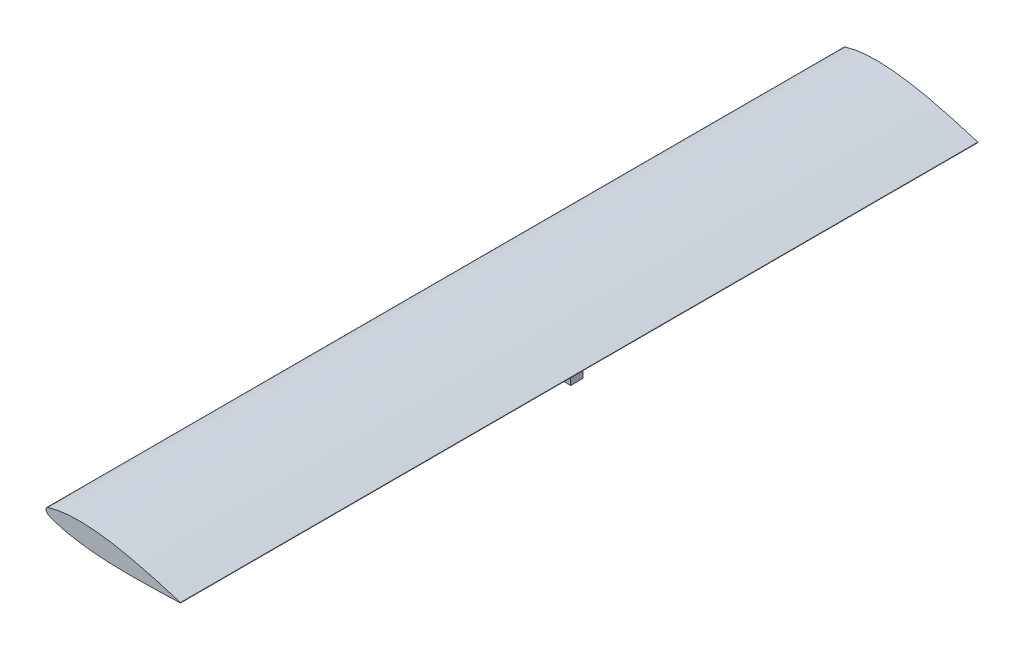
ISO-10303-21;
HEADER;
FILE_DESCRIPTION(('STEP AP214'),'2;1');
FILE_NAME('part.step','',(''),(''),'','','');
FILE_SCHEMA(('AUTOMOTIVE_DESIGN { 1 0 10303 214 1 1 1 1 }'));
ENDSEC;
DATA;
#1=APPLICATION_CONTEXT('core data for automotive mechanical design processes');
#2=APPLICATION_PROTOCOL_DEFINITION('international standard','automotive_design',2000,#1);
#3=PRODUCT_CONTEXT('',#1,'mechanical');
#4=PRODUCT('Part','Part','',(#3));
#5=PRODUCT_RELATED_PRODUCT_CATEGORY('part','',(#4));
#6=PRODUCT_DEFINITION_FORMATION('','',#4);
#7=PRODUCT_DEFINITION_CONTEXT('part definition',#1,'design');
#8=PRODUCT_DEFINITION('design','',#6,#7);
#9=PRODUCT_DEFINITION_SHAPE('','',#8);
#10=(LENGTH_UNIT() NAMED_UNIT(*) SI_UNIT(.MILLI.,.METRE.));
#11=(NAMED_UNIT(*) PLANE_ANGLE_UNIT() SI_UNIT($,.RADIAN.));
#12=(NAMED_UNIT(*) SI_UNIT($,.STERADIAN.) SOLID_ANGLE_UNIT());
#13=UNCERTAINTY_MEASURE_WITH_UNIT(LENGTH_MEASURE(1.E-05),#10,'distance_accuracy_value','');
#14=(GEOMETRIC_REPRESENTATION_CONTEXT(3) GLOBAL_UNCERTAINTY_ASSIGNED_CONTEXT((#13)) GLOBAL_UNIT_ASSIGNED_CONTEXT((#10,
#11,#12)) REPRESENTATION_CONTEXT('',''));
#15=CARTESIAN_POINT('',(0.,0.,0.));
#16=DIRECTION('',(0.,0.,1.));
#17=DIRECTION('',(1.,0.,0.));
#18=AXIS2_PLACEMENT_3D('',#15,#16,#17);
#19=CARTESIAN_POINT('',(9.29048460918074,-9.08103926298808,1590.));
#20=CARTESIAN_POINT('',(82.8889232202925,-36.554453488998,1590.));
#21=CARTESIAN_POINT('',(198.099785007976,-28.7820789022848,1590.));
#22=CARTESIAN_POINT('',(270.840654692993,-27.1694638421733,1590.));
#23=B_SPLINE_CURVE_WITH_KNOTS('',3,(#19,#20,#21,#22),.UNSPECIFIED.,.F.,.F.,(4,4),(0.,1.),.UNSPECIFIED.);
#24=DIRECTION('',(0.,0.,-1.));
#25=VECTOR('',#24,1.);
#26=SURFACE_OF_LINEAR_EXTRUSION('',#23,#25);
#27=CARTESIAN_POINT('',(9.29048460918074,-9.08103926298808,0.));
#28=CARTESIAN_POINT('',(82.8889232202925,-36.554453488998,0.));
#29=CARTESIAN_POINT('',(198.099785007976,-28.7820789022848,0.));
#30=CARTESIAN_POINT('',(270.840654692993,-27.1694638421733,0.));
#31=B_SPLINE_CURVE_WITH_KNOTS('',3,(#27,#28,#29,#30),.UNSPECIFIED.,.F.,.F.,(4,4),(0.,1.),.UNSPECIFIED.);
#32=CARTESIAN_POINT('',(9.29048460918074,-9.08103926298808,0.));
#33=VERTEX_POINT('',#32);
#34=CARTESIAN_POINT('',(267.776708097799,-27.2403195337262,0.));
#35=VERTEX_POINT('',#34);
#36=EDGE_CURVE('E166',#33,#35,#31,.T.);
#37=ORIENTED_EDGE('',*,*,#36,.T.);
#38=DIRECTION('',(0.,0.,-1.));
#39=VECTOR('',#38,1.);
#40=CARTESIAN_POINT('',(267.776708097814,-27.2403195337258,0.));
#41=LINE('',#40,#39);
#42=CARTESIAN_POINT('',(267.776708097799,-27.2403195337262,1590.));
#43=VERTEX_POINT('',#42);
#44=EDGE_CURVE('E41',#35,#43,#41,.F.);
#45=ORIENTED_EDGE('',*,*,#44,.T.);
#46=CARTESIAN_POINT('',(9.29048460918074,-9.08103926298808,1590.));
#47=VERTEX_POINT('',#46);
#48=EDGE_CURVE('E128',#47,#43,#23,.T.);
#49=ORIENTED_EDGE('',*,*,#48,.F.);
#50=DIRECTION('',(0.,0.,-1.));
#51=VECTOR('',#50,1.);
#52=CARTESIAN_POINT('',(9.29048460918074,-9.08103926298808,1590.));
#53=LINE('',#52,#51);
#54=EDGE_CURVE('E165',#47,#33,#53,.T.);
#55=ORIENTED_EDGE('',*,*,#54,.T.);
#56=EDGE_LOOP('',(#37,#45,#49,#55));
#57=FACE_BOUND('',#56,.T.);
#58=DIRECTION('',(0.,0.,-1.));
#59=VECTOR('',#58,1.);
#60=CARTESIAN_POINT('',(263.53359635349,-27.3469635738188,1590.));
#61=LINE('',#60,#59);
#62=CARTESIAN_POINT('',(263.533596353484,-27.346963573819,807.5));
#63=VERTEX_POINT('',#62);
#64=CARTESIAN_POINT('',(263.533596353484,-27.346963573819,782.5));
#65=VERTEX_POINT('',#64);
#66=EDGE_CURVE('E48',#63,#65,#61,.T.);
#67=ORIENTED_EDGE('',*,*,#66,.T.);
#68=CARTESIAN_POINT('',(9.29048460918074,-9.08103926298808,782.5));
#69=CARTESIAN_POINT('',(82.8889232202925,-36.554453488998,782.5));
#70=CARTESIAN_POINT('',(198.099785007976,-28.7820789022848,782.5));
#71=CARTESIAN_POINT('',(270.840654692993,-27.1694638421733,782.5));
#72=B_SPLINE_CURVE_WITH_KNOTS('',3,(#68,#69,#70,#71),.UNSPECIFIED.,.F.,.F.,(4,4),(0.,1.),.UNSPECIFIED.);
#73=CARTESIAN_POINT('',(13.5335963534903,-10.6103584132308,782.5));
#74=VERTEX_POINT('',#73);
#75=EDGE_CURVE('E52',#65,#74,#72,.F.);
#76=ORIENTED_EDGE('',*,*,#75,.T.);
#77=DIRECTION('',(0.,0.,-1.));
#78=VECTOR('',#77,1.);
#79=CARTESIAN_POINT('',(13.5335963534903,-10.6103584132308,1590.));
#80=LINE('',#79,#78);
#81=CARTESIAN_POINT('',(13.5335963534903,-10.6103584132029,807.5));
#82=VERTEX_POINT('',#81);
#83=EDGE_CURVE('E92',#74,#82,#80,.F.);
#84=ORIENTED_EDGE('',*,*,#83,.T.);
#85=CARTESIAN_POINT('',(9.29048460918074,-9.08103926298808,807.5));
#86=CARTESIAN_POINT('',(82.8889232202925,-36.554453488998,807.5));
#87=CARTESIAN_POINT('',(198.099785007976,-28.7820789022848,807.5));
#88=CARTESIAN_POINT('',(270.840654692993,-27.1694638421733,807.5));
#89=B_SPLINE_CURVE_WITH_KNOTS('',3,(#85,#86,#87,#88),.UNSPECIFIED.,.F.,.F.,(4,4),(0.,1.),.UNSPECIFIED.);
#90=EDGE_CURVE('E94',#82,#63,#89,.T.);
#91=ORIENTED_EDGE('',*,*,#90,.T.);
#92=EDGE_LOOP('',(#67,#76,#84,#91));
#93=FACE_BOUND('',#92,.T.);
#94=ADVANCED_FACE('F33',(#57,#93),#26,.F.);
#95=CARTESIAN_POINT('',(3.13121266642964,5.54928803448308,1590.));
#96=CARTESIAN_POINT('',(72.834644417802,27.4331069240272,1590.));
#97=CARTESIAN_POINT('',(171.280571565961,3.72571284093954,1590.));
#98=CARTESIAN_POINT('',(270.840654692993,-27.1694638421733,1590.));
#99=B_SPLINE_CURVE_WITH_KNOTS('',3,(#95,#96,#97,#98),.UNSPECIFIED.,.F.,.F.,(4,4),(0.,1.),.UNSPECIFIED.);
#100=DIRECTION('',(0.,0.,-1.));
#101=VECTOR('',#100,1.);
#102=SURFACE_OF_LINEAR_EXTRUSION('',#99,#101);
#103=CARTESIAN_POINT('',(3.13121266642964,5.54928803448308,1590.));
#104=VERTEX_POINT('',#103);
#105=CARTESIAN_POINT('',(267.912282747009,-26.2627422075403,1590.));
#106=VERTEX_POINT('',#105);
#107=EDGE_CURVE('E137',#104,#106,#99,.T.);
#108=ORIENTED_EDGE('',*,*,#107,.T.);
#109=DIRECTION('',(0.,0.,-1.));
#110=VECTOR('',#109,1.);
#111=CARTESIAN_POINT('',(267.912282747009,-26.2627422075403,1590.));
#112=LINE('',#111,#110);
#113=CARTESIAN_POINT('',(267.912282747009,-26.2627422075403,0.));
#114=VERTEX_POINT('',#113);
#115=EDGE_CURVE('E196',#106,#114,#112,.T.);
#116=ORIENTED_EDGE('',*,*,#115,.T.);
#117=CARTESIAN_POINT('',(3.13121266642964,5.54928803448308,0.));
#118=CARTESIAN_POINT('',(72.834644417802,27.4331069240272,0.));
#119=CARTESIAN_POINT('',(171.280571565961,3.72571284093954,0.));
#120=CARTESIAN_POINT('',(270.840654692993,-27.1694638421733,0.));
#121=B_SPLINE_CURVE_WITH_KNOTS('',3,(#117,#118,#119,#120),.UNSPECIFIED.,.F.,.F.,(4,4),(0.,1.),.UNSPECIFIED.);
#122=CARTESIAN_POINT('',(3.13121266642964,5.54928803448308,0.));
#123=VERTEX_POINT('',#122);
#124=EDGE_CURVE('E174',#123,#114,#121,.T.);
#125=ORIENTED_EDGE('',*,*,#124,.F.);
#126=DIRECTION('',(0.,0.,-1.));
#127=VECTOR('',#126,1.);
#128=CARTESIAN_POINT('',(3.13121266642964,5.54928803448308,1590.));
#129=LINE('',#128,#127);
#130=EDGE_CURVE('E194',#104,#123,#129,.T.);
#131=ORIENTED_EDGE('',*,*,#130,.F.);
#132=EDGE_LOOP('',(#108,#116,#125,#131));
#133=FACE_BOUND('',#132,.T.);
#134=ADVANCED_FACE('F148',(#133),#102,.T.);
#135=CARTESIAN_POINT('',(3.13121266642964,5.54928803448308,1590.));
#136=CARTESIAN_POINT('',(-1.83338348029868,3.99062269757032,1590.));
#137=CARTESIAN_POINT('',(-1.88658978280653,-4.90877147577944,1590.));
#138=CARTESIAN_POINT('',(9.29048460918074,-9.08103926298808,1590.));
#139=B_SPLINE_CURVE_WITH_KNOTS('',3,(#135,#136,#137,#138),.UNSPECIFIED.,.F.,.F.,(4,4),(0.,1.),.UNSPECIFIED.);
#140=DIRECTION('',(0.,0.,-1.));
#141=VECTOR('',#140,1.);
#142=SURFACE_OF_LINEAR_EXTRUSION('',#139,#141);
#143=CARTESIAN_POINT('',(3.13121266642964,5.54928803448308,0.));
#144=CARTESIAN_POINT('',(-1.83338348029868,3.99062269757032,0.));
#145=CARTESIAN_POINT('',(-1.88658978280653,-4.90877147577944,0.));
#146=CARTESIAN_POINT('',(9.29048460918074,-9.08103926298808,0.));
#147=B_SPLINE_CURVE_WITH_KNOTS('',3,(#143,#144,#145,#146),.UNSPECIFIED.,.F.,.F.,(4,4),(0.,1.),.UNSPECIFIED.);
#148=EDGE_CURVE('E138',#123,#33,#147,.T.);
#149=ORIENTED_EDGE('',*,*,#148,.T.);
#150=ORIENTED_EDGE('',*,*,#54,.F.);
#151=EDGE_CURVE('E160',#104,#47,#139,.T.);
#152=ORIENTED_EDGE('',*,*,#151,.F.);
#153=ORIENTED_EDGE('',*,*,#130,.T.);
#154=EDGE_LOOP('',(#149,#150,#152,#153));
#155=FACE_BOUND('',#154,.T.);
#156=ADVANCED_FACE('F152',(#155),#142,.F.);
#157=CARTESIAN_POINT('',(140.387157998372,-29.0325125348762,1590.));
#158=DIRECTION('',(0.,0.,-1.));
#159=DIRECTION('',(-1.,0.,0.));
#160=AXIS2_PLACEMENT_3D('',#157,#158,#159);
#161=PLANE('',#160);
#162=ORIENTED_EDGE('',*,*,#48,.T.);
#163=CARTESIAN_POINT('',(267.764695405389,-26.740463859335,1590.));
#164=DIRECTION('',(0.,0.,-1.));
#165=DIRECTION('',(-1.,0.,0.));
#166=AXIS2_PLACEMENT_3D('',#163,#164,#165);
#167=CIRCLE('',#166,0.5);
#168=EDGE_CURVE('E11',#43,#106,#167,.F.);
#169=ORIENTED_EDGE('',*,*,#168,.T.);
#170=ORIENTED_EDGE('',*,*,#107,.F.);
#171=ORIENTED_EDGE('',*,*,#151,.T.);
#172=EDGE_LOOP('',(#162,#169,#170,#171));
#173=FACE_BOUND('',#172,.T.);
#174=ADVANCED_FACE('F156',(#173),#161,.F.);
#175=CARTESIAN_POINT('',(140.387157998372,-29.0325125348762,0.));
#176=DIRECTION('',(0.,0.,-1.));
#177=DIRECTION('',(-1.,0.,0.));
#178=AXIS2_PLACEMENT_3D('',#175,#176,#177);
#179=PLANE('',#178);
#180=ORIENTED_EDGE('',*,*,#124,.T.);
#181=CARTESIAN_POINT('',(267.764695405389,-26.740463859335,0.));
#182=DIRECTION('',(0.,0.,-1.));
#183=DIRECTION('',(-1.,0.,0.));
#184=AXIS2_PLACEMENT_3D('',#181,#182,#183);
#185=CIRCLE('',#184,0.5);
#186=EDGE_CURVE('E199',#114,#35,#185,.T.);
#187=ORIENTED_EDGE('',*,*,#186,.T.);
#188=ORIENTED_EDGE('',*,*,#36,.F.);
#189=ORIENTED_EDGE('',*,*,#148,.F.);
#190=EDGE_LOOP('',(#180,#187,#188,#189));
#191=FACE_BOUND('',#190,.T.);
#192=ADVANCED_FACE('F158',(#191),#179,.T.);
#193=CARTESIAN_POINT('',(267.764695405389,-26.740463859335,795.));
#194=DIRECTION('',(0.,0.,-1.));
#195=DIRECTION('',(-1.,0.,0.));
#196=AXIS2_PLACEMENT_3D('',#193,#194,#195);
#197=CYLINDRICAL_SURFACE('',#196,0.5);
#198=ORIENTED_EDGE('',*,*,#168,.F.);
#199=ORIENTED_EDGE('',*,*,#44,.F.);
#200=ORIENTED_EDGE('',*,*,#186,.F.);
#201=ORIENTED_EDGE('',*,*,#115,.F.);
#202=EDGE_LOOP('',(#198,#199,#200,#201));
#203=FACE_BOUND('',#202,.T.);
#204=ADVANCED_FACE('F35',(#203),#197,.T.);
#205=CARTESIAN_POINT('',(263.53359635349,500000.,782.5));
#206=DIRECTION('',(-1.,0.,0.));
#207=DIRECTION('',(0.,0.,1.));
#208=AXIS2_PLACEMENT_3D('',#205,#206,#207);
#209=PLANE('',#208);
#210=ORIENTED_EDGE('',*,*,#66,.F.);
#211=DIRECTION('',(0.,-1.,0.));
#212=VECTOR('',#211,1.);
#213=CARTESIAN_POINT('',(263.53359635349,500000.,807.5));
#214=LINE('',#213,#212);
#215=CARTESIAN_POINT('',(263.53359635349,-45.,807.5));
#216=VERTEX_POINT('',#215);
#217=EDGE_CURVE('E105',#63,#216,#214,.T.);
#218=ORIENTED_EDGE('',*,*,#217,.T.);
#219=DIRECTION('',(0.,0.,-1.));
#220=VECTOR('',#219,1.);
#221=CARTESIAN_POINT('',(263.53359635349,-45.,782.5));
#222=LINE('',#221,#220);
#223=CARTESIAN_POINT('',(263.53359635349,-45.,782.5));
#224=VERTEX_POINT('',#223);
#225=EDGE_CURVE('E175',#216,#224,#222,.T.);
#226=ORIENTED_EDGE('',*,*,#225,.T.);
#227=DIRECTION('',(0.,-1.,0.));
#228=VECTOR('',#227,1.);
#229=CARTESIAN_POINT('',(263.53359635349,500000.,782.5));
#230=LINE('',#229,#228);
#231=EDGE_CURVE('E115',#65,#224,#230,.T.);
#232=ORIENTED_EDGE('',*,*,#231,.F.);
#233=EDGE_LOOP('',(#210,#218,#226,#232));
#234=FACE_BOUND('',#233,.T.);
#235=ADVANCED_FACE('F219',(#234),#209,.F.);
#236=CARTESIAN_POINT('',(13.5335963534903,500000.,782.5));
#237=DIRECTION('',(0.,0.,1.));
#238=DIRECTION('',(1.,0.,0.));
#239=AXIS2_PLACEMENT_3D('',#236,#237,#238);
#240=PLANE('',#239);
#241=ORIENTED_EDGE('',*,*,#75,.F.);
#242=ORIENTED_EDGE('',*,*,#231,.T.);
#243=DIRECTION('',(-1.,0.,0.));
#244=VECTOR('',#243,1.);
#245=CARTESIAN_POINT('',(13.5335963534903,-45.,782.5));
#246=LINE('',#245,#244);
#247=CARTESIAN_POINT('',(13.5335963534903,-45.,782.5));
#248=VERTEX_POINT('',#247);
#249=EDGE_CURVE('E113',#224,#248,#246,.T.);
#250=ORIENTED_EDGE('',*,*,#249,.T.);
#251=DIRECTION('',(0.,-1.,0.));
#252=VECTOR('',#251,1.);
#253=CARTESIAN_POINT('',(13.5335963534903,500000.,782.5));
#254=LINE('',#253,#252);
#255=EDGE_CURVE('E111',#74,#248,#254,.T.);
#256=ORIENTED_EDGE('',*,*,#255,.F.);
#257=EDGE_LOOP('',(#241,#242,#250,#256));
#258=FACE_BOUND('',#257,.T.);
#259=ADVANCED_FACE('F228',(#258),#240,.F.);
#260=CARTESIAN_POINT('',(13.5335963534903,500000.,807.5));
#261=DIRECTION('',(1.,0.,0.));
#262=DIRECTION('',(0.,0.,-1.));
#263=AXIS2_PLACEMENT_3D('',#260,#261,#262);
#264=PLANE('',#263);
#265=ORIENTED_EDGE('',*,*,#83,.F.);
#266=ORIENTED_EDGE('',*,*,#255,.T.);
#267=DIRECTION('',(0.,0.,1.));
#268=VECTOR('',#267,1.);
#269=CARTESIAN_POINT('',(13.5335963534903,-45.,807.5));
#270=LINE('',#269,#268);
#271=CARTESIAN_POINT('',(13.5335963534903,-45.,807.5));
#272=VERTEX_POINT('',#271);
#273=EDGE_CURVE('E109',#248,#272,#270,.T.);
#274=ORIENTED_EDGE('',*,*,#273,.T.);
#275=DIRECTION('',(0.,-1.,0.));
#276=VECTOR('',#275,1.);
#277=CARTESIAN_POINT('',(13.5335963534903,500000.,807.5));
#278=LINE('',#277,#276);
#279=EDGE_CURVE('E103',#82,#272,#278,.T.);
#280=ORIENTED_EDGE('',*,*,#279,.F.);
#281=EDGE_LOOP('',(#265,#266,#274,#280));
#282=FACE_BOUND('',#281,.T.);
#283=ADVANCED_FACE('F107',(#282),#264,.F.);
#284=CARTESIAN_POINT('',(263.53359635349,500000.,807.5));
#285=DIRECTION('',(0.,0.,-1.));
#286=DIRECTION('',(-1.,0.,0.));
#287=AXIS2_PLACEMENT_3D('',#284,#285,#286);
#288=PLANE('',#287);
#289=ORIENTED_EDGE('',*,*,#90,.F.);
#290=ORIENTED_EDGE('',*,*,#279,.T.);
#291=DIRECTION('',(1.,0.,0.));
#292=VECTOR('',#291,1.);
#293=CARTESIAN_POINT('',(263.53359635349,-45.,807.5));
#294=LINE('',#293,#292);
#295=EDGE_CURVE('E242',#272,#216,#294,.T.);
#296=ORIENTED_EDGE('',*,*,#295,.T.);
#297=ORIENTED_EDGE('',*,*,#217,.F.);
#298=EDGE_LOOP('',(#289,#290,#296,#297));
#299=FACE_BOUND('',#298,.T.);
#300=ADVANCED_FACE('F101',(#299),#288,.F.);
#301=CARTESIAN_POINT('',(0.,-45.,0.));
#302=DIRECTION('',(0.,-1.,0.));
#303=DIRECTION('',(0.,0.,-1.));
#304=AXIS2_PLACEMENT_3D('',#301,#302,#303);
#305=PLANE('',#304);
#306=ORIENTED_EDGE('',*,*,#225,.F.);
#307=ORIENTED_EDGE('',*,*,#295,.F.);
#308=ORIENTED_EDGE('',*,*,#273,.F.);
#309=ORIENTED_EDGE('',*,*,#249,.F.);
#310=EDGE_LOOP('',(#306,#307,#308,#309));
#311=FACE_BOUND('',#310,.T.);
#312=ADVANCED_FACE('F220',(#311),#305,.T.);
#313=CLOSED_SHELL('',(#94,#134,#156,#174,#192,#204,#235,#259,#283,#300,#312));
#314=MANIFOLD_SOLID_BREP('B2',#313);
#315=ADVANCED_BREP_SHAPE_REPRESENTATION('',(#18,#314),#14);
#316=SHAPE_DEFINITION_REPRESENTATION(#9,#315);
ENDSEC;
END-ISO-10303-21;
